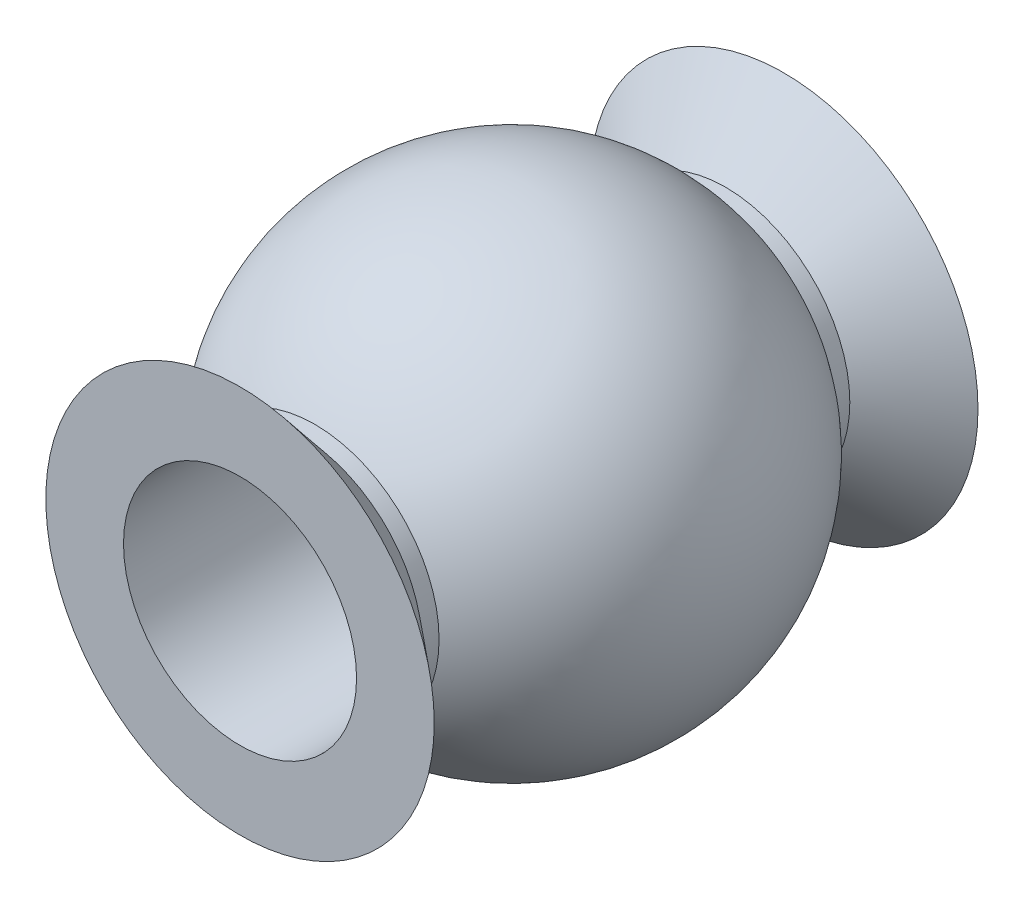
ISO-10303-21;
HEADER;
FILE_DESCRIPTION(('STEP AP214'),'2;1');
FILE_NAME('part.step','',(''),(''),'','','');
FILE_SCHEMA(('AUTOMOTIVE_DESIGN { 1 0 10303 214 1 1 1 1 }'));
ENDSEC;
DATA;
#1=APPLICATION_CONTEXT('core data for automotive mechanical design processes');
#2=APPLICATION_PROTOCOL_DEFINITION('international standard','automotive_design',2000,#1);
#3=PRODUCT_CONTEXT('',#1,'mechanical');
#4=PRODUCT('Part','Part','',(#3));
#5=PRODUCT_RELATED_PRODUCT_CATEGORY('part','',(#4));
#6=PRODUCT_DEFINITION_FORMATION('','',#4);
#7=PRODUCT_DEFINITION_CONTEXT('part definition',#1,'design');
#8=PRODUCT_DEFINITION('design','',#6,#7);
#9=PRODUCT_DEFINITION_SHAPE('','',#8);
#10=(LENGTH_UNIT() NAMED_UNIT(*) SI_UNIT(.MILLI.,.METRE.));
#11=(NAMED_UNIT(*) PLANE_ANGLE_UNIT() SI_UNIT($,.RADIAN.));
#12=(NAMED_UNIT(*) SI_UNIT($,.STERADIAN.) SOLID_ANGLE_UNIT());
#13=UNCERTAINTY_MEASURE_WITH_UNIT(LENGTH_MEASURE(1.E-05),#10,'distance_accuracy_value','');
#14=(GEOMETRIC_REPRESENTATION_CONTEXT(3) GLOBAL_UNCERTAINTY_ASSIGNED_CONTEXT((#13)) GLOBAL_UNIT_ASSIGNED_CONTEXT((#10,
#11,#12)) REPRESENTATION_CONTEXT('',''));
#15=CARTESIAN_POINT('',(0.,0.,0.));
#16=DIRECTION('',(0.,0.,1.));
#17=DIRECTION('',(1.,0.,0.));
#18=AXIS2_PLACEMENT_3D('',#15,#16,#17);
#19=CARTESIAN_POINT('',(2.5,0.,0.));
#20=DIRECTION('',(0.,0.,1.));
#21=DIRECTION('',(1.,0.,0.));
#22=AXIS2_PLACEMENT_3D('',#19,#20,#21);
#23=PLANE('',#22);
#24=CARTESIAN_POINT('',(0.,0.,0.));
#25=DIRECTION('',(0.,0.,1.));
#26=DIRECTION('',(1.,0.,0.));
#27=AXIS2_PLACEMENT_3D('',#24,#25,#26);
#28=CIRCLE('',#27,1.5);
#29=CARTESIAN_POINT('',(1.5,0.,0.));
#30=VERTEX_POINT('',#29);
#31=EDGE_CURVE('E57',#30,#30,#28,.T.);
#32=ORIENTED_EDGE('',*,*,#31,.F.);
#33=EDGE_LOOP('',(#32));
#34=FACE_BOUND('',#33,.T.);
#35=CARTESIAN_POINT('',(0.,0.,0.));
#36=DIRECTION('',(0.,0.,1.));
#37=DIRECTION('',(1.,0.,0.));
#38=AXIS2_PLACEMENT_3D('',#35,#36,#37);
#39=CIRCLE('',#38,2.5);
#40=CARTESIAN_POINT('',(2.5,0.,0.));
#41=VERTEX_POINT('',#40);
#42=EDGE_CURVE('E10',#41,#41,#39,.T.);
#43=ORIENTED_EDGE('',*,*,#42,.T.);
#44=EDGE_LOOP('',(#43));
#45=FACE_BOUND('',#44,.T.);
#46=ADVANCED_FACE('F31',(#34,#45),#23,.T.);
#47=CARTESIAN_POINT('',(0.,0.,0.));
#48=DIRECTION('',(0.,0.,1.));
#49=DIRECTION('',(1.,0.,0.));
#50=AXIS2_PLACEMENT_3D('',#47,#48,#49);
#51=CONICAL_SURFACE('',#50,2.5,0.876058050598193);
#52=CARTESIAN_POINT('',(0.,0.,-0.75));
#53=DIRECTION('',(0.,0.,1.));
#54=DIRECTION('',(1.,0.,0.));
#55=AXIS2_PLACEMENT_3D('',#52,#53,#54);
#56=CIRCLE('',#55,1.6);
#57=CARTESIAN_POINT('',(1.6,0.,-0.75));
#58=VERTEX_POINT('',#57);
#59=EDGE_CURVE('E37',#58,#58,#56,.T.);
#60=ORIENTED_EDGE('',*,*,#59,.T.);
#61=EDGE_LOOP('',(#60));
#62=FACE_BOUND('',#61,.T.);
#63=ORIENTED_EDGE('',*,*,#42,.F.);
#64=EDGE_LOOP('',(#63));
#65=FACE_BOUND('',#64,.T.);
#66=ADVANCED_FACE('F73',(#62,#65),#51,.T.);
#67=CARTESIAN_POINT('',(0.,0.,0.));
#68=DIRECTION('',(0.,0.,1.));
#69=DIRECTION('',(1.,0.,0.));
#70=AXIS2_PLACEMENT_3D('',#67,#68,#69);
#71=CYLINDRICAL_SURFACE('',#70,1.6);
#72=CARTESIAN_POINT('',(0.,0.,-0.962284491910096));
#73=DIRECTION('',(0.,0.,1.));
#74=DIRECTION('',(1.,0.,0.));
#75=AXIS2_PLACEMENT_3D('',#72,#73,#74);
#76=CIRCLE('',#75,1.6);
#77=CARTESIAN_POINT('',(1.6,0.,-0.962284491910096));
#78=VERTEX_POINT('',#77);
#79=EDGE_CURVE('E41',#78,#78,#76,.T.);
#80=ORIENTED_EDGE('',*,*,#79,.T.);
#81=EDGE_LOOP('',(#80));
#82=FACE_BOUND('',#81,.T.);
#83=ORIENTED_EDGE('',*,*,#59,.F.);
#84=EDGE_LOOP('',(#83));
#85=FACE_BOUND('',#84,.T.);
#86=ADVANCED_FACE('F77',(#82,#85),#71,.T.);
#87=CARTESIAN_POINT('',(0.,0.,-3.5));
#88=DIRECTION('',(0.,0.,1.));
#89=DIRECTION('',(1.,0.,0.));
#90=AXIS2_PLACEMENT_3D('',#87,#88,#89);
#91=SPHERICAL_SURFACE('',#90,3.);
#92=CARTESIAN_POINT('',(0.,0.,-6.0377155080899));
#93=DIRECTION('',(0.,0.,1.));
#94=DIRECTION('',(1.,0.,0.));
#95=AXIS2_PLACEMENT_3D('',#92,#93,#94);
#96=CIRCLE('',#95,1.6);
#97=CARTESIAN_POINT('',(1.6,0.,-6.0377155080899));
#98=VERTEX_POINT('',#97);
#99=EDGE_CURVE('E45',#98,#98,#96,.T.);
#100=CARTESIAN_POINT('',(1.6,0.,-6.0377155080899));
#101=CARTESIAN_POINT('',(1.65330742927456,0.,-6.00410913695083));
#102=CARTESIAN_POINT('',(1.70555269014528,0.,-5.96881866912858));
#103=CARTESIAN_POINT('',(1.80771875275377,0.,-5.89501970899523));
#104=CARTESIAN_POINT('',(1.85763955449154,0.,-5.85651121668412));
#105=CARTESIAN_POINT('',(1.95495657650887,0.,-5.77642637645057));
#106=CARTESIAN_POINT('',(2.00235279678842,0.,-5.73485002852812));
#107=CARTESIAN_POINT('',(2.09443302797944,0.,-5.64879524749287));
#108=CARTESIAN_POINT('',(2.13911703889089,0.,-5.60431681438007));
#109=CARTESIAN_POINT('',(2.22559532768323,0.,-5.5126342367104));
#110=CARTESIAN_POINT('',(2.26738960556411,0.,-5.46543009215352));
#111=CARTESIAN_POINT('',(2.34792255362298,0.,-5.36848353145094));
#112=CARTESIAN_POINT('',(2.38666122380097,0.,-5.31874111530524));
#113=CARTESIAN_POINT('',(2.46092916416741,0.,-5.21691546169381));
#114=CARTESIAN_POINT('',(2.49645843435585,0.,-5.16483222422807));
#115=CARTESIAN_POINT('',(2.56416653566753,0.,-5.0585316883291));
#116=CARTESIAN_POINT('',(2.59634536679075,0.,-5.00431438989587));
#117=CARTESIAN_POINT('',(2.65722484783473,0.,-4.89396095934202));
#118=CARTESIAN_POINT('',(2.68592549775549,0.,-4.83782482722139));
#119=CARTESIAN_POINT('',(2.73973468262821,0.,-4.72385657509991));
#120=CARTESIAN_POINT('',(2.76484321758018,0.,-4.66602445509905));
#121=CARTESIAN_POINT('',(2.81136849824647,0.,-4.54889380530643));
#122=CARTESIAN_POINT('',(2.8327852439608,0.,-4.48959527551465));
#123=CARTESIAN_POINT('',(2.87184192737171,0.,-4.36976720557796));
#124=CARTESIAN_POINT('',(2.88948186506829,0.,-4.30923766543304));
#125=CARTESIAN_POINT('',(2.92091490657101,0.,-4.1871878609877));
#126=CARTESIAN_POINT('',(2.93470801037716,0.,-4.12566759668728));
#127=CARTESIAN_POINT('',(2.9583926291402,0.,-4.00188056304696));
#128=CARTESIAN_POINT('',(2.96828414409709,0.,-3.93961379370706));
#129=CARTESIAN_POINT('',(2.98412631847334,0.,-3.81458093252887));
#130=CARTESIAN_POINT('',(2.99007697789269,0.,-3.75181484069057));
#131=CARTESIAN_POINT('',(2.99801381865602,0.,-3.62603249923485));
#132=CARTESIAN_POINT('',(3.,0.,-3.56301624961742));
#133=CARTESIAN_POINT('',(3.,0.,-3.43698375038258));
#134=CARTESIAN_POINT('',(2.99801381865602,0.,-3.37396750076515));
#135=CARTESIAN_POINT('',(2.99007697789269,0.,-3.24818515930943));
#136=CARTESIAN_POINT('',(2.98412631847334,0.,-3.18541906747113));
#137=CARTESIAN_POINT('',(2.96828414409709,0.,-3.06038620629294));
#138=CARTESIAN_POINT('',(2.9583926291402,0.,-2.99811943695304));
#139=CARTESIAN_POINT('',(2.93470801037716,0.,-2.87433240331273));
#140=CARTESIAN_POINT('',(2.92091490657101,0.,-2.81281213901231));
#141=CARTESIAN_POINT('',(2.88948186506829,0.,-2.69076233456696));
#142=CARTESIAN_POINT('',(2.87184192737171,0.,-2.63023279442204));
#143=CARTESIAN_POINT('',(2.8327852439608,0.,-2.51040472448535));
#144=CARTESIAN_POINT('',(2.81136849824647,0.,-2.45110619469358));
#145=CARTESIAN_POINT('',(2.76484321758018,0.,-2.33397554490095));
#146=CARTESIAN_POINT('',(2.73973468262821,0.,-2.2761434249001));
#147=CARTESIAN_POINT('',(2.68592549775549,0.,-2.16217517277862));
#148=CARTESIAN_POINT('',(2.65722484783473,0.,-2.10603904065799));
#149=CARTESIAN_POINT('',(2.59634536679075,0.,-1.99568561010413));
#150=CARTESIAN_POINT('',(2.56416653566753,0.,-1.9414683116709));
#151=CARTESIAN_POINT('',(2.49645843435586,0.,-1.83516777577193));
#152=CARTESIAN_POINT('',(2.46092916416741,0.,-1.7830845383062));
#153=CARTESIAN_POINT('',(2.38666122380097,0.,-1.68125888469476));
#154=CARTESIAN_POINT('',(2.34792255362298,0.,-1.63151646854906));
#155=CARTESIAN_POINT('',(2.26738960556411,0.,-1.53456990784648));
#156=CARTESIAN_POINT('',(2.22559532768323,0.,-1.48736576328961));
#157=CARTESIAN_POINT('',(2.1391170388909,0.,-1.39568318561993));
#158=CARTESIAN_POINT('',(2.09443302797944,0.,-1.35120475250713));
#159=CARTESIAN_POINT('',(2.00235279678842,0.,-1.26514997147188));
#160=CARTESIAN_POINT('',(1.95495657650887,0.,-1.22357362354943));
#161=CARTESIAN_POINT('',(1.85763955449154,0.,-1.14348878331588));
#162=CARTESIAN_POINT('',(1.80771875275377,0.,-1.10498029100478));
#163=CARTESIAN_POINT('',(1.70555269014529,0.,-1.03118133087142));
#164=CARTESIAN_POINT('',(1.65330742927457,0.,-0.995890863049173));
#165=CARTESIAN_POINT('',(1.6,0.,-0.962284491910096));
#166=B_SPLINE_CURVE_WITH_KNOTS('',3,(#100,#101,#102,#103,#104,#105,#106,#107,#108,#109,#110,
#111,#112,#113,#114,#115,#116,#117,#118,#119,#120,#121,#122,#123,#124,#125,#126,#127,#128,#129,
#130,#131,#132,#133,#134,#135,#136,#137,#138,#139,#140,#141,#142,#143,#144,#145,#146,#147,#148,
#149,#150,#151,#152,#153,#154,#155,#156,#157,#158,#159,#160,#161,#162,#163,#164,#165),
.UNSPECIFIED.,.F.,.F.,(4,2,2,2,2,2,2,2,2,2,2,2,2,2,2,2,2,2,2,2,2,2,2,2,2,2,2,2,2,2,2,2,4),(0.,
0.189017486899729,0.378034973799459,0.567052460699188,0.756069947598917,0.945087434498646,
1.13410492139838,1.3231224082981,1.51213989519783,1.70115738209756,1.89017486899729,
2.07919235589702,2.26820984279675,2.45722732969648,2.64624481659621,2.83526230349594,
3.02427979039567,3.2132972772954,3.40231476419512,3.59133225109485,3.78034973799458,
3.96936722489431,4.15838471179404,4.34740219869377,4.5364196855935,4.72543717249323,
4.91445465939296,5.10347214629269,5.29248963319242,5.48150712009215,5.67052460699187,
5.8595420938916,6.04855958079133),.UNSPECIFIED.);
#167=EDGE_CURVE('BSEAM81',#98,#78,#166,.T.);
#168=ORIENTED_EDGE('',*,*,#99,.T.);
#169=ORIENTED_EDGE('',*,*,#79,.F.);
#170=ORIENTED_EDGE('',*,*,#167,.T.);
#171=ORIENTED_EDGE('',*,*,#167,.F.);
#172=EDGE_LOOP('',(#168,#170,#169,#171));
#173=FACE_BOUND('',#172,.T.);
#174=ADVANCED_FACE('F81',(#173),#91,.T.);
#175=CARTESIAN_POINT('',(0.,0.,0.));
#176=DIRECTION('',(0.,0.,1.));
#177=DIRECTION('',(1.,0.,0.));
#178=AXIS2_PLACEMENT_3D('',#175,#176,#177);
#179=CYLINDRICAL_SURFACE('',#178,1.6);
#180=CARTESIAN_POINT('',(0.,0.,-6.25));
#181=DIRECTION('',(0.,0.,1.));
#182=DIRECTION('',(1.,0.,0.));
#183=AXIS2_PLACEMENT_3D('',#180,#181,#182);
#184=CIRCLE('',#183,1.6);
#185=CARTESIAN_POINT('',(1.6,0.,-6.25));
#186=VERTEX_POINT('',#185);
#187=EDGE_CURVE('E50',#186,#186,#184,.T.);
#188=ORIENTED_EDGE('',*,*,#187,.T.);
#189=EDGE_LOOP('',(#188));
#190=FACE_BOUND('',#189,.T.);
#191=ORIENTED_EDGE('',*,*,#99,.F.);
#192=EDGE_LOOP('',(#191));
#193=FACE_BOUND('',#192,.T.);
#194=ADVANCED_FACE('F88',(#190,#193),#179,.T.);
#195=CARTESIAN_POINT('',(0.,0.,-6.25));
#196=DIRECTION('',(0.,0.,-1.));
#197=DIRECTION('',(-1.,0.,0.));
#198=AXIS2_PLACEMENT_3D('',#195,#196,#197);
#199=CONICAL_SURFACE('',#198,1.6,0.876058050598193);
#200=CARTESIAN_POINT('',(0.,0.,-7.));
#201=DIRECTION('',(0.,0.,1.));
#202=DIRECTION('',(1.,0.,0.));
#203=AXIS2_PLACEMENT_3D('',#200,#201,#202);
#204=CIRCLE('',#203,2.5);
#205=CARTESIAN_POINT('',(2.5,0.,-7.));
#206=VERTEX_POINT('',#205);
#207=EDGE_CURVE('E53',#206,#206,#204,.T.);
#208=ORIENTED_EDGE('',*,*,#207,.T.);
#209=EDGE_LOOP('',(#208));
#210=FACE_BOUND('',#209,.T.);
#211=ORIENTED_EDGE('',*,*,#187,.F.);
#212=EDGE_LOOP('',(#211));
#213=FACE_BOUND('',#212,.T.);
#214=ADVANCED_FACE('F92',(#210,#213),#199,.T.);
#215=CARTESIAN_POINT('',(0.,0.,-7.));
#216=DIRECTION('',(0.,0.,-1.));
#217=DIRECTION('',(-1.,0.,0.));
#218=AXIS2_PLACEMENT_3D('',#215,#216,#217);
#219=PLANE('',#218);
#220=CARTESIAN_POINT('',(0.,0.,-7.));
#221=DIRECTION('',(0.,0.,1.));
#222=DIRECTION('',(1.,0.,0.));
#223=AXIS2_PLACEMENT_3D('',#220,#221,#222);
#224=CIRCLE('',#223,1.5);
#225=CARTESIAN_POINT('',(1.5,0.,-7.));
#226=VERTEX_POINT('',#225);
#227=EDGE_CURVE('E56',#226,#226,#224,.T.);
#228=ORIENTED_EDGE('',*,*,#227,.T.);
#229=EDGE_LOOP('',(#228));
#230=FACE_BOUND('',#229,.T.);
#231=ORIENTED_EDGE('',*,*,#207,.F.);
#232=EDGE_LOOP('',(#231));
#233=FACE_BOUND('',#232,.T.);
#234=ADVANCED_FACE('F63',(#230,#233),#219,.T.);
#235=CARTESIAN_POINT('',(0.,0.,-7.));
#236=DIRECTION('',(0.,0.,1.));
#237=DIRECTION('',(1.,0.,0.));
#238=AXIS2_PLACEMENT_3D('',#235,#236,#237);
#239=CYLINDRICAL_SURFACE('',#238,1.5);
#240=ORIENTED_EDGE('',*,*,#227,.F.);
#241=EDGE_LOOP('',(#240));
#242=FACE_BOUND('',#241,.T.);
#243=ORIENTED_EDGE('',*,*,#31,.T.);
#244=EDGE_LOOP('',(#243));
#245=FACE_BOUND('',#244,.T.);
#246=ADVANCED_FACE('F66',(#242,#245),#239,.F.);
#247=CLOSED_SHELL('',(#46,#66,#86,#174,#194,#214,#234,#246));
#248=MANIFOLD_SOLID_BREP('B2',#247);
#249=ADVANCED_BREP_SHAPE_REPRESENTATION('',(#18,#248),#14);
#250=SHAPE_DEFINITION_REPRESENTATION(#9,#249);
ENDSEC;
END-ISO-10303-21;
